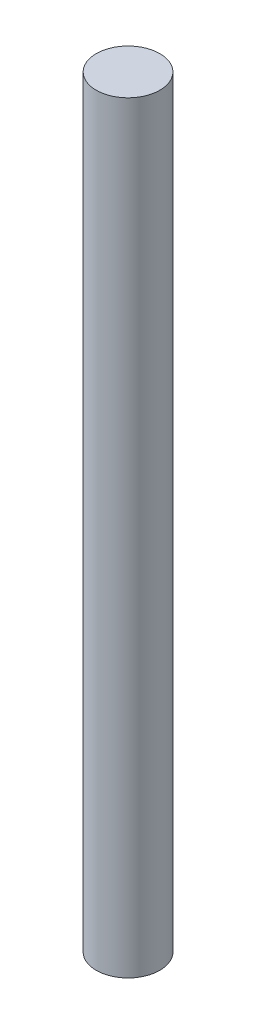
ISO-10303-21;
HEADER;
FILE_DESCRIPTION(('STEP AP214'),'2;1');
FILE_NAME('part.step','',(''),(''),'','','');
FILE_SCHEMA(('AUTOMOTIVE_DESIGN { 1 0 10303 214 1 1 1 1 }'));
ENDSEC;
DATA;
#1=APPLICATION_CONTEXT('core data for automotive mechanical design processes');
#2=APPLICATION_PROTOCOL_DEFINITION('international standard','automotive_design',2000,#1);
#3=PRODUCT_CONTEXT('',#1,'mechanical');
#4=PRODUCT('Part','Part','',(#3));
#5=PRODUCT_RELATED_PRODUCT_CATEGORY('part','',(#4));
#6=PRODUCT_DEFINITION_FORMATION('','',#4);
#7=PRODUCT_DEFINITION_CONTEXT('part definition',#1,'design');
#8=PRODUCT_DEFINITION('design','',#6,#7);
#9=PRODUCT_DEFINITION_SHAPE('','',#8);
#10=(LENGTH_UNIT() NAMED_UNIT(*) SI_UNIT(.MILLI.,.METRE.));
#11=(NAMED_UNIT(*) PLANE_ANGLE_UNIT() SI_UNIT($,.RADIAN.));
#12=(NAMED_UNIT(*) SI_UNIT($,.STERADIAN.) SOLID_ANGLE_UNIT());
#13=UNCERTAINTY_MEASURE_WITH_UNIT(LENGTH_MEASURE(1.E-05),#10,'distance_accuracy_value','');
#14=(GEOMETRIC_REPRESENTATION_CONTEXT(3) GLOBAL_UNCERTAINTY_ASSIGNED_CONTEXT((#13)) GLOBAL_UNIT_ASSIGNED_CONTEXT((#10,
#11,#12)) REPRESENTATION_CONTEXT('',''));
#15=CARTESIAN_POINT('',(0.,0.,0.));
#16=DIRECTION('',(0.,0.,1.));
#17=DIRECTION('',(1.,0.,0.));
#18=AXIS2_PLACEMENT_3D('',#15,#16,#17);
#19=CARTESIAN_POINT('',(0.,720.,0.));
#20=DIRECTION('',(0.,-1.,0.));
#21=DIRECTION('',(0.,0.,-1.));
#22=AXIS2_PLACEMENT_3D('',#19,#20,#21);
#23=CYLINDRICAL_SURFACE('',#22,30.);
#24=CARTESIAN_POINT('',(0.,720.,0.));
#25=DIRECTION('',(0.,1.,0.));
#26=DIRECTION('',(0.,0.,1.));
#27=AXIS2_PLACEMENT_3D('',#24,#25,#26);
#28=CIRCLE('',#27,30.);
#29=CARTESIAN_POINT('',(0.,720.,-30.));
#30=VERTEX_POINT('',#29);
#31=EDGE_CURVE('E10',#30,#30,#28,.T.);
#32=CARTESIAN_POINT('',(0.,0.,0.));
#33=DIRECTION('',(0.,1.,0.));
#34=DIRECTION('',(0.,0.,1.));
#35=AXIS2_PLACEMENT_3D('',#32,#33,#34);
#36=CIRCLE('',#35,30.);
#37=CARTESIAN_POINT('',(0.,-1.11022302462516E-13,-30.));
#38=VERTEX_POINT('',#37);
#39=EDGE_CURVE('E40',#38,#38,#36,.T.);
#40=CARTESIAN_POINT('',(0.,720.,-30.));
#41=CARTESIAN_POINT('',(0.,712.5,-30.));
#42=CARTESIAN_POINT('',(0.,705.,-30.));
#43=CARTESIAN_POINT('',(0.,690.,-30.));
#44=CARTESIAN_POINT('',(0.,682.5,-30.));
#45=CARTESIAN_POINT('',(0.,667.5,-30.));
#46=CARTESIAN_POINT('',(0.,660.,-30.));
#47=CARTESIAN_POINT('',(0.,645.,-30.));
#48=CARTESIAN_POINT('',(0.,637.5,-30.));
#49=CARTESIAN_POINT('',(0.,622.5,-30.));
#50=CARTESIAN_POINT('',(0.,615.,-30.));
#51=CARTESIAN_POINT('',(0.,600.,-30.));
#52=CARTESIAN_POINT('',(0.,592.5,-30.));
#53=CARTESIAN_POINT('',(0.,577.5,-30.));
#54=CARTESIAN_POINT('',(0.,570.,-30.));
#55=CARTESIAN_POINT('',(0.,555.,-30.));
#56=CARTESIAN_POINT('',(0.,547.5,-30.));
#57=CARTESIAN_POINT('',(0.,532.5,-30.));
#58=CARTESIAN_POINT('',(0.,525.,-30.));
#59=CARTESIAN_POINT('',(0.,510.,-30.));
#60=CARTESIAN_POINT('',(0.,502.5,-30.));
#61=CARTESIAN_POINT('',(0.,487.5,-30.));
#62=CARTESIAN_POINT('',(0.,480.,-30.));
#63=CARTESIAN_POINT('',(0.,465.,-30.));
#64=CARTESIAN_POINT('',(0.,457.5,-30.));
#65=CARTESIAN_POINT('',(0.,442.5,-30.));
#66=CARTESIAN_POINT('',(0.,435.,-30.));
#67=CARTESIAN_POINT('',(0.,420.,-30.));
#68=CARTESIAN_POINT('',(0.,412.5,-30.));
#69=CARTESIAN_POINT('',(0.,397.5,-30.));
#70=CARTESIAN_POINT('',(0.,390.,-30.));
#71=CARTESIAN_POINT('',(0.,375.,-30.));
#72=CARTESIAN_POINT('',(0.,367.5,-30.));
#73=CARTESIAN_POINT('',(0.,352.5,-30.));
#74=CARTESIAN_POINT('',(0.,345.,-30.));
#75=CARTESIAN_POINT('',(0.,330.,-30.));
#76=CARTESIAN_POINT('',(0.,322.5,-30.));
#77=CARTESIAN_POINT('',(0.,307.5,-30.));
#78=CARTESIAN_POINT('',(0.,300.,-30.));
#79=CARTESIAN_POINT('',(0.,285.,-30.));
#80=CARTESIAN_POINT('',(0.,277.5,-30.));
#81=CARTESIAN_POINT('',(0.,262.5,-30.));
#82=CARTESIAN_POINT('',(0.,255.,-30.));
#83=CARTESIAN_POINT('',(0.,240.,-30.));
#84=CARTESIAN_POINT('',(0.,232.5,-30.));
#85=CARTESIAN_POINT('',(0.,217.5,-30.));
#86=CARTESIAN_POINT('',(0.,210.,-30.));
#87=CARTESIAN_POINT('',(0.,195.,-30.));
#88=CARTESIAN_POINT('',(0.,187.5,-30.));
#89=CARTESIAN_POINT('',(0.,172.5,-30.));
#90=CARTESIAN_POINT('',(0.,165.,-30.));
#91=CARTESIAN_POINT('',(0.,150.,-30.));
#92=CARTESIAN_POINT('',(0.,142.5,-30.));
#93=CARTESIAN_POINT('',(0.,127.5,-30.));
#94=CARTESIAN_POINT('',(0.,120.,-30.));
#95=CARTESIAN_POINT('',(0.,105.,-30.));
#96=CARTESIAN_POINT('',(0.,97.5,-30.));
#97=CARTESIAN_POINT('',(0.,82.4999999999999,-30.));
#98=CARTESIAN_POINT('',(0.,74.9999999999999,-30.));
#99=CARTESIAN_POINT('',(0.,59.9999999999999,-30.));
#100=CARTESIAN_POINT('',(0.,52.4999999999999,-30.));
#101=CARTESIAN_POINT('',(0.,37.4999999999999,-30.));
#102=CARTESIAN_POINT('',(0.,29.9999999999999,-30.));
#103=CARTESIAN_POINT('',(0.,14.9999999999999,-30.));
#104=CARTESIAN_POINT('',(0.,7.49999999999989,-30.));
#105=CARTESIAN_POINT('',(0.,-1.11022302462516E-13,-30.));
#106=B_SPLINE_CURVE_WITH_KNOTS('',3,(#40,#41,#42,#43,#44,#45,#46,#47,#48,#49,#50,#51,#52,#53,
#54,#55,#56,#57,#58,#59,#60,#61,#62,#63,#64,#65,#66,#67,#68,#69,#70,#71,#72,#73,#74,#75,#76,#77,
#78,#79,#80,#81,#82,#83,#84,#85,#86,#87,#88,#89,#90,#91,#92,#93,#94,#95,#96,#97,#98,#99,#100,
#101,#102,#103,#104,#105),.UNSPECIFIED.,.F.,.F.,(4,2,2,2,2,2,2,2,2,2,2,2,2,2,2,2,2,2,2,2,2,2,2,
2,2,2,2,2,2,2,2,2,4),(0.,22.5000000000001,45.,67.5000000000001,90.0000000000001,112.5,135.,
157.5,180.,202.5,225.,247.5,270.,292.5,315.,337.5,360.,382.5,405.,427.5,450.,472.5,495.,517.5,
540.,562.5,585.,607.5,630.,652.5,675.,697.5,720.),.UNSPECIFIED.);
#107=EDGE_CURVE('BSEAM37',#30,#38,#106,.T.);
#108=ORIENTED_EDGE('',*,*,#31,.F.);
#109=ORIENTED_EDGE('',*,*,#39,.T.);
#110=ORIENTED_EDGE('',*,*,#107,.T.);
#111=ORIENTED_EDGE('',*,*,#107,.F.);
#112=EDGE_LOOP('',(#108,#110,#109,#111));
#113=FACE_BOUND('',#112,.T.);
#114=ADVANCED_FACE('F37',(#113),#23,.T.);
#115=CARTESIAN_POINT('',(0.,720.,0.));
#116=DIRECTION('',(0.,1.,0.));
#117=DIRECTION('',(0.,0.,1.));
#118=AXIS2_PLACEMENT_3D('',#115,#116,#117);
#119=PLANE('',#118);
#120=ORIENTED_EDGE('',*,*,#31,.T.);
#121=EDGE_LOOP('',(#120));
#122=FACE_BOUND('',#121,.T.);
#123=ADVANCED_FACE('F52',(#122),#119,.T.);
#124=CARTESIAN_POINT('',(0.,0.,0.));
#125=DIRECTION('',(0.,1.,0.));
#126=DIRECTION('',(0.,0.,1.));
#127=AXIS2_PLACEMENT_3D('',#124,#125,#126);
#128=PLANE('',#127);
#129=ORIENTED_EDGE('',*,*,#39,.F.);
#130=EDGE_LOOP('',(#129));
#131=FACE_BOUND('',#130,.T.);
#132=ADVANCED_FACE('F50',(#131),#128,.F.);
#133=CLOSED_SHELL('',(#114,#123,#132));
#134=MANIFOLD_SOLID_BREP('B2',#133);
#135=ADVANCED_BREP_SHAPE_REPRESENTATION('',(#18,#134),#14);
#136=SHAPE_DEFINITION_REPRESENTATION(#9,#135);
ENDSEC;
END-ISO-10303-21;
